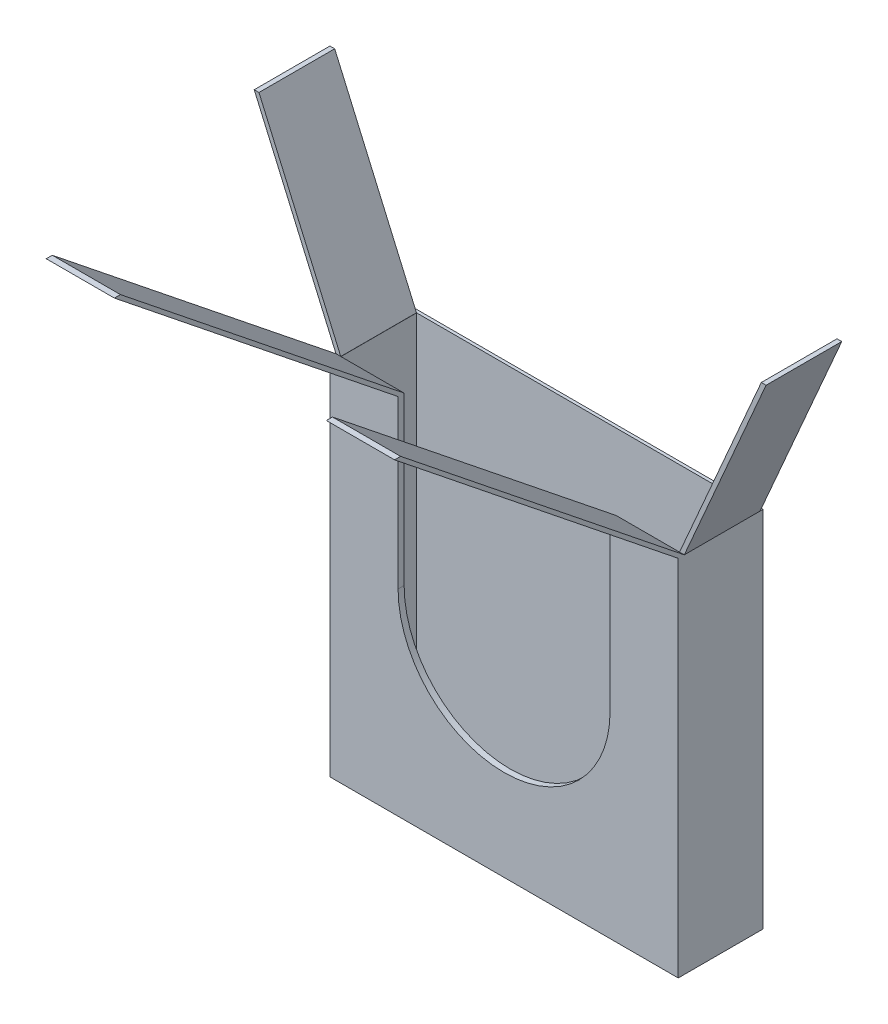
ISO-10303-21;
HEADER;
FILE_DESCRIPTION(('STEP AP214'),'2;1');
FILE_NAME('part.step','',(''),(''),'','','');
FILE_SCHEMA(('AUTOMOTIVE_DESIGN { 1 0 10303 214 1 1 1 1 }'));
ENDSEC;
DATA;
#1=APPLICATION_CONTEXT('core data for automotive mechanical design processes');
#2=APPLICATION_PROTOCOL_DEFINITION('international standard','automotive_design',2000,#1);
#3=PRODUCT_CONTEXT('',#1,'mechanical');
#4=PRODUCT('Part','Part','',(#3));
#5=PRODUCT_RELATED_PRODUCT_CATEGORY('part','',(#4));
#6=PRODUCT_DEFINITION_FORMATION('','',#4);
#7=PRODUCT_DEFINITION_CONTEXT('part definition',#1,'design');
#8=PRODUCT_DEFINITION('design','',#6,#7);
#9=PRODUCT_DEFINITION_SHAPE('','',#8);
#10=(LENGTH_UNIT() NAMED_UNIT(*) SI_UNIT(.MILLI.,.METRE.));
#11=(NAMED_UNIT(*) PLANE_ANGLE_UNIT() SI_UNIT($,.RADIAN.));
#12=(NAMED_UNIT(*) SI_UNIT($,.STERADIAN.) SOLID_ANGLE_UNIT());
#13=UNCERTAINTY_MEASURE_WITH_UNIT(LENGTH_MEASURE(1.E-05),#10,'distance_accuracy_value','');
#14=(GEOMETRIC_REPRESENTATION_CONTEXT(3) GLOBAL_UNCERTAINTY_ASSIGNED_CONTEXT((#13)) GLOBAL_UNIT_ASSIGNED_CONTEXT((#10,
#11,#12)) REPRESENTATION_CONTEXT('',''));
#15=CARTESIAN_POINT('',(0.,0.,0.));
#16=DIRECTION('',(0.,0.,1.));
#17=DIRECTION('',(1.,0.,0.));
#18=AXIS2_PLACEMENT_3D('',#15,#16,#17);
#19=CARTESIAN_POINT('',(0.,0.,-63.5));
#20=DIRECTION('',(0.,0.,-1.));
#21=DIRECTION('',(-1.,0.,0.));
#22=AXIS2_PLACEMENT_3D('',#19,#20,#21);
#23=PLANE('',#22);
#24=DIRECTION('',(1.,0.,0.));
#25=VECTOR('',#24,1.);
#26=CARTESIAN_POINT('',(146.05,152.399999999999,-63.5));
#27=LINE('',#26,#25);
#28=CARTESIAN_POINT('',(-146.05,152.399999999999,-63.5));
#29=VERTEX_POINT('',#28);
#30=CARTESIAN_POINT('',(-142.059608362807,152.399999999999,-63.5));
#31=VERTEX_POINT('',#30);
#32=EDGE_CURVE('E45',#29,#31,#27,.T.);
#33=ORIENTED_EDGE('',*,*,#32,.F.);
#34=DIRECTION('',(0.399280062298119,-0.91682900905851,0.));
#35=VECTOR('',#34,1.);
#36=CARTESIAN_POINT('',(-146.05,152.399999999999,-63.5));
#37=LINE('',#36,#35);
#38=CARTESIAN_POINT('',(-214.625070232172,309.862442089425,-63.5));
#39=VERTEX_POINT('',#38);
#40=EDGE_CURVE('E260',#39,#29,#37,.T.);
#41=ORIENTED_EDGE('',*,*,#40,.F.);
#42=DIRECTION('',(-1.,0.,0.));
#43=VECTOR('',#42,1.);
#44=CARTESIAN_POINT('',(-214.625070232172,309.862442089425,-63.5));
#45=LINE('',#44,#43);
#46=CARTESIAN_POINT('',(-210.634678594979,309.862442089425,-63.5));
#47=VERTEX_POINT('',#46);
#48=EDGE_CURVE('E256',#47,#39,#45,.T.);
#49=ORIENTED_EDGE('',*,*,#48,.F.);
#50=DIRECTION('',(-0.399280062298119,0.91682900905851,0.));
#51=VECTOR('',#50,1.);
#52=CARTESIAN_POINT('',(-210.634678594979,309.862442089425,-63.5));
#53=LINE('',#52,#51);
#54=EDGE_CURVE('E53',#31,#47,#53,.T.);
#55=ORIENTED_EDGE('',*,*,#54,.F.);
#56=EDGE_LOOP('',(#33,#41,#49,#55));
#57=FACE_BOUND('',#56,.T.);
#58=ADVANCED_FACE('F35',(#57),#23,.T.);
#59=CARTESIAN_POINT('',(-146.05,152.399999999999,5.08));
#60=DIRECTION('',(0.,-1.,0.));
#61=DIRECTION('',(1.,0.,0.));
#62=AXIS2_PLACEMENT_3D('',#59,#60,#61);
#63=PLANE('',#62);
#64=DIRECTION('',(0.,0.,-1.));
#65=VECTOR('',#64,1.);
#66=CARTESIAN_POINT('',(-142.059608362807,152.399999999999,173.378680710981));
#67=LINE('',#66,#65);
#68=CARTESIAN_POINT('',(-142.059608362807,152.399999999999,0.));
#69=VERTEX_POINT('',#68);
#70=EDGE_CURVE('E255',#69,#31,#67,.T.);
#71=ORIENTED_EDGE('',*,*,#70,.F.);
#72=DIRECTION('',(1.,0.,0.));
#73=VECTOR('',#72,1.);
#74=CARTESIAN_POINT('',(-454.831897372867,152.399999999999,0.));
#75=LINE('',#74,#73);
#76=CARTESIAN_POINT('',(-141.934676660714,152.399999999999,0.));
#77=VERTEX_POINT('',#76);
#78=EDGE_CURVE('E245',#69,#77,#75,.T.);
#79=ORIENTED_EDGE('',*,*,#78,.T.);
#80=DIRECTION('',(0.,0.,1.));
#81=VECTOR('',#80,1.);
#82=CARTESIAN_POINT('',(-141.934676660714,152.399999999999,-63.5));
#83=LINE('',#82,#81);
#84=CARTESIAN_POINT('',(-141.934676660714,152.399999999999,-63.5));
#85=VERTEX_POINT('',#84);
#86=EDGE_CURVE('E312',#85,#77,#83,.T.);
#87=ORIENTED_EDGE('',*,*,#86,.F.);
#88=CARTESIAN_POINT('',(142.059608362807,152.399999999999,-63.5));
#89=VERTEX_POINT('',#88);
#90=EDGE_CURVE('E46',#85,#89,#27,.T.);
#91=ORIENTED_EDGE('',*,*,#90,.T.);
#92=CARTESIAN_POINT('',(146.05,152.399999999999,-63.5));
#93=VERTEX_POINT('',#92);
#94=EDGE_CURVE('E11',#89,#93,#27,.T.);
#95=ORIENTED_EDGE('',*,*,#94,.T.);
#96=DIRECTION('',(0.,0.,1.));
#97=VECTOR('',#96,1.);
#98=CARTESIAN_POINT('',(146.05,152.399999999999,-66.04));
#99=LINE('',#98,#97);
#100=CARTESIAN_POINT('',(146.05,152.399999999999,-66.04));
#101=VERTEX_POINT('',#100);
#102=EDGE_CURVE('E224',#101,#93,#99,.T.);
#103=ORIENTED_EDGE('',*,*,#102,.F.);
#104=DIRECTION('',(1.,0.,0.));
#105=VECTOR('',#104,1.);
#106=CARTESIAN_POINT('',(146.05,152.399999999999,-66.04));
#107=LINE('',#106,#105);
#108=CARTESIAN_POINT('',(-146.05,152.399999999999,-66.04));
#109=VERTEX_POINT('',#108);
#110=EDGE_CURVE('E218',#109,#101,#107,.T.);
#111=ORIENTED_EDGE('',*,*,#110,.F.);
#112=DIRECTION('',(0.,0.,1.));
#113=VECTOR('',#112,1.);
#114=CARTESIAN_POINT('',(-146.05,152.399999999999,-66.04));
#115=LINE('',#114,#113);
#116=EDGE_CURVE('E227',#109,#29,#115,.T.);
#117=ORIENTED_EDGE('',*,*,#116,.T.);
#118=ORIENTED_EDGE('',*,*,#32,.T.);
#119=EDGE_LOOP('',(#71,#79,#87,#91,#95,#103,#111,#117,#118));
#120=FACE_BOUND('',#119,.T.);
#121=ADVANCED_FACE('F447',(#120),#63,.F.);
#122=CARTESIAN_POINT('',(88.9,152.399999999999,5.08));
#123=DIRECTION('',(1.,0.,0.));
#124=DIRECTION('',(0.,1.,0.));
#125=AXIS2_PLACEMENT_3D('',#122,#123,#124);
#126=PLANE('',#125);
#127=DIRECTION('',(0.,-1.,0.));
#128=VECTOR('',#127,1.);
#129=CARTESIAN_POINT('',(88.9,152.399999999999,0.));
#130=LINE('',#129,#128);
#131=CARTESIAN_POINT('',(88.9,152.399999999999,0.));
#132=VERTEX_POINT('',#131);
#133=CARTESIAN_POINT('',(88.9,12.6999999999994,0.));
#134=VERTEX_POINT('',#133);
#135=EDGE_CURVE('E372',#132,#134,#130,.T.);
#136=ORIENTED_EDGE('',*,*,#135,.T.);
#137=DIRECTION('',(0.,0.,-1.));
#138=VECTOR('',#137,1.);
#139=CARTESIAN_POINT('',(88.9,12.6999999999994,5.08));
#140=LINE('',#139,#138);
#141=CARTESIAN_POINT('',(88.9,12.6999999999994,5.08));
#142=VERTEX_POINT('',#141);
#143=EDGE_CURVE('E39',#142,#134,#140,.T.);
#144=ORIENTED_EDGE('',*,*,#143,.F.);
#145=DIRECTION('',(0.,-1.,0.));
#146=VECTOR('',#145,1.);
#147=CARTESIAN_POINT('',(88.9,152.399999999999,5.08));
#148=LINE('',#147,#146);
#149=CARTESIAN_POINT('',(88.9,152.399999999999,5.08));
#150=VERTEX_POINT('',#149);
#151=EDGE_CURVE('E353',#150,#142,#148,.T.);
#152=ORIENTED_EDGE('',*,*,#151,.F.);
#153=DIRECTION('',(0.,0.625,0.7806247497998));
#154=VECTOR('',#153,1.);
#155=CARTESIAN_POINT('',(88.9000000000001,152.399999999999,5.07999999999996));
#156=LINE('',#155,#154);
#157=CARTESIAN_POINT('',(88.9,342.899999999999,243.014423738979));
#158=VERTEX_POINT('',#157);
#159=EDGE_CURVE('E333',#150,#158,#156,.T.);
#160=ORIENTED_EDGE('',*,*,#159,.T.);
#161=DIRECTION('',(0.,0.,-1.));
#162=VECTOR('',#161,1.);
#163=CARTESIAN_POINT('',(88.9,342.899999999999,243.014423738979));
#164=LINE('',#163,#162);
#165=CARTESIAN_POINT('',(88.9,342.899999999999,237.934423738979));
#166=VERTEX_POINT('',#165);
#167=EDGE_CURVE('E331',#158,#166,#164,.T.);
#168=ORIENTED_EDGE('',*,*,#167,.T.);
#169=DIRECTION('',(0.,-0.625,-0.7806247497998));
#170=VECTOR('',#169,1.);
#171=CARTESIAN_POINT('',(88.9,342.899999999999,237.934423738979));
#172=LINE('',#171,#170);
#173=EDGE_CURVE('E336',#166,#132,#172,.T.);
#174=ORIENTED_EDGE('',*,*,#173,.T.);
#175=EDGE_LOOP('',(#136,#144,#152,#160,#168,#174));
#176=FACE_BOUND('',#175,.T.);
#177=ADVANCED_FACE('F37',(#176),#126,.F.);
#178=CARTESIAN_POINT('',(0.,12.6999999999994,5.08));
#179=DIRECTION('',(0.,0.,-1.));
#180=DIRECTION('',(-1.,0.,0.));
#181=AXIS2_PLACEMENT_3D('',#178,#179,#180);
#182=CYLINDRICAL_SURFACE('',#181,88.9);
#183=CARTESIAN_POINT('',(0.,12.6999999999994,0.));
#184=DIRECTION('',(0.,0.,-1.));
#185=DIRECTION('',(1.,0.,0.));
#186=AXIS2_PLACEMENT_3D('',#183,#184,#185);
#187=CIRCLE('',#186,88.9);
#188=CARTESIAN_POINT('',(-88.8999999999999,12.6999999999994,0.));
#189=VERTEX_POINT('',#188);
#190=EDGE_CURVE('E374',#134,#189,#187,.T.);
#191=ORIENTED_EDGE('',*,*,#190,.T.);
#192=DIRECTION('',(0.,0.,-1.));
#193=VECTOR('',#192,1.);
#194=CARTESIAN_POINT('',(-88.8999999999999,12.6999999999994,5.08));
#195=LINE('',#194,#193);
#196=CARTESIAN_POINT('',(-88.8999999999999,12.6999999999994,5.08));
#197=VERTEX_POINT('',#196);
#198=EDGE_CURVE('E380',#197,#189,#195,.T.);
#199=ORIENTED_EDGE('',*,*,#198,.F.);
#200=CARTESIAN_POINT('',(0.,12.6999999999994,5.08));
#201=DIRECTION('',(0.,0.,-1.));
#202=DIRECTION('',(1.,0.,0.));
#203=AXIS2_PLACEMENT_3D('',#200,#201,#202);
#204=CIRCLE('',#203,88.9);
#205=EDGE_CURVE('E356',#142,#197,#204,.T.);
#206=ORIENTED_EDGE('',*,*,#205,.F.);
#207=ORIENTED_EDGE('',*,*,#143,.T.);
#208=EDGE_LOOP('',(#191,#199,#206,#207));
#209=FACE_BOUND('',#208,.T.);
#210=ADVANCED_FACE('F391',(#209),#182,.F.);
#211=CARTESIAN_POINT('',(-88.8999999999999,152.399999999999,5.08));
#212=DIRECTION('',(-1.,0.,0.));
#213=DIRECTION('',(0.,-1.,0.));
#214=AXIS2_PLACEMENT_3D('',#211,#212,#213);
#215=PLANE('',#214);
#216=DIRECTION('',(0.,1.,0.));
#217=VECTOR('',#216,1.);
#218=CARTESIAN_POINT('',(-88.8999999999999,152.399999999999,0.));
#219=LINE('',#218,#217);
#220=CARTESIAN_POINT('',(-88.8999999999999,152.399999999999,0.));
#221=VERTEX_POINT('',#220);
#222=EDGE_CURVE('E376',#189,#221,#219,.T.);
#223=ORIENTED_EDGE('',*,*,#222,.T.);
#224=DIRECTION('',(0.,0.625,0.7806247497998));
#225=VECTOR('',#224,1.);
#226=CARTESIAN_POINT('',(-88.9,342.899999999999,237.934423738979));
#227=LINE('',#226,#225);
#228=CARTESIAN_POINT('',(-88.9,342.899999999999,237.934423738979));
#229=VERTEX_POINT('',#228);
#230=EDGE_CURVE('E230',#221,#229,#227,.T.);
#231=ORIENTED_EDGE('',*,*,#230,.T.);
#232=DIRECTION('',(0.,0.,1.));
#233=VECTOR('',#232,1.);
#234=CARTESIAN_POINT('',(-88.9,342.899999999999,243.014423738979));
#235=LINE('',#234,#233);
#236=CARTESIAN_POINT('',(-88.9,342.899999999999,243.014423738979));
#237=VERTEX_POINT('',#236);
#238=EDGE_CURVE('E239',#229,#237,#235,.T.);
#239=ORIENTED_EDGE('',*,*,#238,.T.);
#240=DIRECTION('',(0.,-0.625,-0.7806247497998));
#241=VECTOR('',#240,1.);
#242=CARTESIAN_POINT('',(-88.8999999999999,152.399999999999,5.08));
#243=LINE('',#242,#241);
#244=CARTESIAN_POINT('',(-88.8999999999999,152.399999999999,5.08));
#245=VERTEX_POINT('',#244);
#246=EDGE_CURVE('E242',#237,#245,#243,.T.);
#247=ORIENTED_EDGE('',*,*,#246,.T.);
#248=DIRECTION('',(0.,1.,0.));
#249=VECTOR('',#248,1.);
#250=CARTESIAN_POINT('',(-88.8999999999999,152.399999999999,5.08));
#251=LINE('',#250,#249);
#252=EDGE_CURVE('E358',#197,#245,#251,.T.);
#253=ORIENTED_EDGE('',*,*,#252,.F.);
#254=ORIENTED_EDGE('',*,*,#198,.T.);
#255=EDGE_LOOP('',(#223,#231,#239,#247,#253,#254));
#256=FACE_BOUND('',#255,.T.);
#257=ADVANCED_FACE('F398',(#256),#215,.F.);
#258=CARTESIAN_POINT('',(-146.05,-152.400000000001,5.08));
#259=DIRECTION('',(1.,0.,0.));
#260=DIRECTION('',(0.,0.,-1.));
#261=AXIS2_PLACEMENT_3D('',#258,#259,#260);
#262=PLANE('',#261);
#263=DIRECTION('',(0.,-1.,0.));
#264=VECTOR('',#263,1.);
#265=CARTESIAN_POINT('',(-146.05,-152.400000000001,5.08));
#266=LINE('',#265,#264);
#267=CARTESIAN_POINT('',(-146.05,152.399999999999,5.08));
#268=VERTEX_POINT('',#267);
#269=CARTESIAN_POINT('',(-146.05,-152.400000000001,5.08));
#270=VERTEX_POINT('',#269);
#271=EDGE_CURVE('E364',#268,#270,#266,.T.);
#272=ORIENTED_EDGE('',*,*,#271,.F.);
#273=DIRECTION('',(0.,0.625,0.7806247497998));
#274=VECTOR('',#273,1.);
#275=CARTESIAN_POINT('',(-146.05,152.399999999999,5.07999999999999));
#276=LINE('',#275,#274);
#277=CARTESIAN_POINT('',(-146.05,342.899999999999,243.014423738979));
#278=VERTEX_POINT('',#277);
#279=EDGE_CURVE('E233',#268,#278,#276,.T.);
#280=ORIENTED_EDGE('',*,*,#279,.T.);
#281=DIRECTION('',(0.,0.,-1.));
#282=VECTOR('',#281,1.);
#283=CARTESIAN_POINT('',(-146.05,342.899999999999,243.014423738979));
#284=LINE('',#283,#282);
#285=CARTESIAN_POINT('',(-146.05,342.899999999999,237.934423738979));
#286=VERTEX_POINT('',#285);
#287=EDGE_CURVE('E231',#278,#286,#284,.T.);
#288=ORIENTED_EDGE('',*,*,#287,.T.);
#289=DIRECTION('',(0.,-0.625,-0.7806247497998));
#290=VECTOR('',#289,1.);
#291=CARTESIAN_POINT('',(-146.05,342.899999999999,237.934423738979));
#292=LINE('',#291,#290);
#293=CARTESIAN_POINT('',(-146.05,152.399999999999,0.));
#294=VERTEX_POINT('',#293);
#295=EDGE_CURVE('E236',#286,#294,#292,.T.);
#296=ORIENTED_EDGE('',*,*,#295,.T.);
#297=DIRECTION('',(0.,0.,-1.));
#298=VECTOR('',#297,1.);
#299=CARTESIAN_POINT('',(-146.05,152.399999999999,173.378680710981));
#300=LINE('',#299,#298);
#301=EDGE_CURVE('E252',#294,#29,#300,.T.);
#302=ORIENTED_EDGE('',*,*,#301,.T.);
#303=ORIENTED_EDGE('',*,*,#116,.F.);
#304=DIRECTION('',(0.,1.,0.));
#305=VECTOR('',#304,1.);
#306=CARTESIAN_POINT('',(-146.05,-152.400000000001,-66.04));
#307=LINE('',#306,#305);
#308=CARTESIAN_POINT('',(-146.05,-152.400000000001,-66.04));
#309=VERTEX_POINT('',#308);
#310=EDGE_CURVE('E214',#309,#109,#307,.T.);
#311=ORIENTED_EDGE('',*,*,#310,.F.);
#312=DIRECTION('',(0.,0.,-1.));
#313=VECTOR('',#312,1.);
#314=CARTESIAN_POINT('',(-146.05,-152.400000000001,5.08));
#315=LINE('',#314,#313);
#316=EDGE_CURVE('E206',#270,#309,#315,.T.);
#317=ORIENTED_EDGE('',*,*,#316,.F.);
#318=EDGE_LOOP('',(#272,#280,#288,#296,#302,#303,#311,#317));
#319=FACE_BOUND('',#318,.T.);
#320=ADVANCED_FACE('F461',(#319),#262,.F.);
#321=CARTESIAN_POINT('',(-146.05,-152.400000000001,5.08));
#322=DIRECTION('',(0.,1.,0.));
#323=DIRECTION('',(-1.,0.,0.));
#324=AXIS2_PLACEMENT_3D('',#321,#322,#323);
#325=PLANE('',#324);
#326=ORIENTED_EDGE('',*,*,#316,.T.);
#327=DIRECTION('',(-1.,0.,0.));
#328=VECTOR('',#327,1.);
#329=CARTESIAN_POINT('',(146.05,-152.400000000001,-66.04));
#330=LINE('',#329,#328);
#331=CARTESIAN_POINT('',(146.05,-152.400000000001,-66.04));
#332=VERTEX_POINT('',#331);
#333=EDGE_CURVE('E209',#332,#309,#330,.T.);
#334=ORIENTED_EDGE('',*,*,#333,.F.);
#335=DIRECTION('',(0.,0.,-1.));
#336=VECTOR('',#335,1.);
#337=CARTESIAN_POINT('',(146.05,-152.400000000001,5.08));
#338=LINE('',#337,#336);
#339=CARTESIAN_POINT('',(146.05,-152.400000000001,5.08));
#340=VERTEX_POINT('',#339);
#341=EDGE_CURVE('E196',#340,#332,#338,.T.);
#342=ORIENTED_EDGE('',*,*,#341,.F.);
#343=DIRECTION('',(1.,0.,0.));
#344=VECTOR('',#343,1.);
#345=CARTESIAN_POINT('',(-146.05,-152.400000000001,5.08));
#346=LINE('',#345,#344);
#347=EDGE_CURVE('E366',#270,#340,#346,.T.);
#348=ORIENTED_EDGE('',*,*,#347,.F.);
#349=EDGE_LOOP('',(#326,#334,#342,#348));
#350=FACE_BOUND('',#349,.T.);
#351=ADVANCED_FACE('F210',(#350),#325,.F.);
#352=CARTESIAN_POINT('',(146.05,-152.400000000001,5.08));
#353=DIRECTION('',(-1.,0.,0.));
#354=DIRECTION('',(0.,-1.,0.));
#355=AXIS2_PLACEMENT_3D('',#352,#353,#354);
#356=PLANE('',#355);
#357=ORIENTED_EDGE('',*,*,#341,.T.);
#358=DIRECTION('',(0.,-1.,0.));
#359=VECTOR('',#358,1.);
#360=CARTESIAN_POINT('',(146.05,-152.400000000001,-66.04));
#361=LINE('',#360,#359);
#362=EDGE_CURVE('E201',#101,#332,#361,.T.);
#363=ORIENTED_EDGE('',*,*,#362,.F.);
#364=ORIENTED_EDGE('',*,*,#102,.T.);
#365=DIRECTION('',(0.,0.,1.));
#366=VECTOR('',#365,1.);
#367=CARTESIAN_POINT('',(146.05,152.399999999999,-63.5));
#368=LINE('',#367,#366);
#369=CARTESIAN_POINT('',(146.05,152.399999999999,0.));
#370=VERTEX_POINT('',#369);
#371=EDGE_CURVE('E320',#93,#370,#368,.T.);
#372=ORIENTED_EDGE('',*,*,#371,.T.);
#373=DIRECTION('',(0.,0.625,0.7806247497998));
#374=VECTOR('',#373,1.);
#375=CARTESIAN_POINT('',(146.05,342.899999999999,237.934423738979));
#376=LINE('',#375,#374);
#377=CARTESIAN_POINT('',(146.05,342.899999999999,237.934423738979));
#378=VERTEX_POINT('',#377);
#379=EDGE_CURVE('E330',#370,#378,#376,.T.);
#380=ORIENTED_EDGE('',*,*,#379,.T.);
#381=DIRECTION('',(0.,0.,1.));
#382=VECTOR('',#381,1.);
#383=CARTESIAN_POINT('',(146.05,342.899999999999,243.014423738979));
#384=LINE('',#383,#382);
#385=CARTESIAN_POINT('',(146.05,342.899999999999,243.014423738979));
#386=VERTEX_POINT('',#385);
#387=EDGE_CURVE('E339',#378,#386,#384,.T.);
#388=ORIENTED_EDGE('',*,*,#387,.T.);
#389=DIRECTION('',(0.,-0.625,-0.7806247497998));
#390=VECTOR('',#389,1.);
#391=CARTESIAN_POINT('',(146.05,152.399999999999,5.08));
#392=LINE('',#391,#390);
#393=CARTESIAN_POINT('',(146.05,152.399999999999,5.08));
#394=VERTEX_POINT('',#393);
#395=EDGE_CURVE('E342',#386,#394,#392,.T.);
#396=ORIENTED_EDGE('',*,*,#395,.T.);
#397=DIRECTION('',(0.,1.,0.));
#398=VECTOR('',#397,1.);
#399=CARTESIAN_POINT('',(146.05,-152.400000000001,5.08));
#400=LINE('',#399,#398);
#401=EDGE_CURVE('E203',#340,#394,#400,.T.);
#402=ORIENTED_EDGE('',*,*,#401,.F.);
#403=EDGE_LOOP('',(#357,#363,#364,#372,#380,#388,#396,#402));
#404=FACE_BOUND('',#403,.T.);
#405=ADVANCED_FACE('F198',(#404),#356,.F.);
#406=CARTESIAN_POINT('',(0.,12.6999999999994,5.08));
#407=DIRECTION('',(0.,0.,1.));
#408=DIRECTION('',(1.,0.,0.));
#409=AXIS2_PLACEMENT_3D('',#406,#407,#408);
#410=PLANE('',#409);
#411=DIRECTION('',(-1.,0.,0.));
#412=VECTOR('',#411,1.);
#413=CARTESIAN_POINT('',(88.9,152.399999999999,5.08));
#414=LINE('',#413,#412);
#415=EDGE_CURVE('E350',#394,#150,#414,.T.);
#416=ORIENTED_EDGE('',*,*,#415,.T.);
#417=ORIENTED_EDGE('',*,*,#151,.T.);
#418=ORIENTED_EDGE('',*,*,#205,.T.);
#419=ORIENTED_EDGE('',*,*,#252,.T.);
#420=DIRECTION('',(-1.,0.,0.));
#421=VECTOR('',#420,1.);
#422=CARTESIAN_POINT('',(-146.05,152.399999999999,5.08));
#423=LINE('',#422,#421);
#424=EDGE_CURVE('E361',#245,#268,#423,.T.);
#425=ORIENTED_EDGE('',*,*,#424,.T.);
#426=ORIENTED_EDGE('',*,*,#271,.T.);
#427=ORIENTED_EDGE('',*,*,#347,.T.);
#428=ORIENTED_EDGE('',*,*,#401,.T.);
#429=EDGE_LOOP('',(#416,#417,#418,#419,#425,#426,#427,#428));
#430=FACE_BOUND('',#429,.T.);
#431=ADVANCED_FACE('F413',(#430),#410,.T.);
#432=CARTESIAN_POINT('',(0.,12.6999999999994,0.));
#433=DIRECTION('',(0.,0.,1.));
#434=DIRECTION('',(1.,0.,0.));
#435=AXIS2_PLACEMENT_3D('',#432,#433,#434);
#436=PLANE('',#435);
#437=DIRECTION('',(-1.,0.,0.));
#438=VECTOR('',#437,1.);
#439=CARTESIAN_POINT('',(0.,-147.172428926353,0.));
#440=LINE('',#439,#438);
#441=CARTESIAN_POINT('',(142.059608362807,-147.172428926353,0.));
#442=VERTEX_POINT('',#441);
#443=CARTESIAN_POINT('',(-141.934676660714,-147.172428926353,0.));
#444=VERTEX_POINT('',#443);
#445=EDGE_CURVE('E314',#442,#444,#440,.T.);
#446=ORIENTED_EDGE('',*,*,#445,.T.);
#447=DIRECTION('',(0.,1.,0.));
#448=VECTOR('',#447,1.);
#449=CARTESIAN_POINT('',(-141.934676660714,0.,0.));
#450=LINE('',#449,#448);
#451=EDGE_CURVE('E61',#444,#77,#450,.T.);
#452=ORIENTED_EDGE('',*,*,#451,.T.);
#453=DIRECTION('',(-1.,0.,0.));
#454=VECTOR('',#453,1.);
#455=CARTESIAN_POINT('',(-146.05,152.399999999999,0.));
#456=LINE('',#455,#454);
#457=EDGE_CURVE('E354',#221,#77,#456,.T.);
#458=ORIENTED_EDGE('',*,*,#457,.F.);
#459=ORIENTED_EDGE('',*,*,#222,.F.);
#460=ORIENTED_EDGE('',*,*,#190,.F.);
#461=ORIENTED_EDGE('',*,*,#135,.F.);
#462=DIRECTION('',(-1.,0.,0.));
#463=VECTOR('',#462,1.);
#464=CARTESIAN_POINT('',(88.9,152.399999999999,0.));
#465=LINE('',#464,#463);
#466=CARTESIAN_POINT('',(142.059608362807,152.399999999999,0.));
#467=VERTEX_POINT('',#466);
#468=EDGE_CURVE('E349',#467,#132,#465,.T.);
#469=ORIENTED_EDGE('',*,*,#468,.F.);
#470=DIRECTION('',(0.,1.,0.));
#471=VECTOR('',#470,1.);
#472=CARTESIAN_POINT('',(142.059608362807,0.,0.));
#473=LINE('',#472,#471);
#474=EDGE_CURVE('E306',#442,#467,#473,.T.);
#475=ORIENTED_EDGE('',*,*,#474,.F.);
#476=EDGE_LOOP('',(#446,#452,#458,#459,#460,#461,#469,#475));
#477=FACE_BOUND('',#476,.T.);
#478=ADVANCED_FACE('F395',(#477),#436,.F.);
#479=CARTESIAN_POINT('',(-219.881897372867,152.399999999999,5.08));
#480=DIRECTION('',(0.,-0.7806247497998,0.625));
#481=DIRECTION('',(0.,-0.625,-0.7806247497998));
#482=AXIS2_PLACEMENT_3D('',#479,#480,#481);
#483=PLANE('',#482);
#484=ORIENTED_EDGE('',*,*,#159,.F.);
#485=ORIENTED_EDGE('',*,*,#415,.F.);
#486=ORIENTED_EDGE('',*,*,#395,.F.);
#487=DIRECTION('',(1.,0.,0.));
#488=VECTOR('',#487,1.);
#489=CARTESIAN_POINT('',(-219.881897372867,342.899999999999,243.014423738979));
#490=LINE('',#489,#488);
#491=EDGE_CURVE('E334',#158,#386,#490,.T.);
#492=ORIENTED_EDGE('',*,*,#491,.F.);
#493=EDGE_LOOP('',(#484,#485,#486,#492));
#494=FACE_BOUND('',#493,.T.);
#495=ADVANCED_FACE('F426',(#494),#483,.T.);
#496=CARTESIAN_POINT('',(-219.881897372867,342.899999999999,243.014423738979));
#497=DIRECTION('',(0.,1.,0.));
#498=DIRECTION('',(-1.,0.,0.));
#499=AXIS2_PLACEMENT_3D('',#496,#497,#498);
#500=PLANE('',#499);
#501=ORIENTED_EDGE('',*,*,#167,.F.);
#502=ORIENTED_EDGE('',*,*,#491,.T.);
#503=ORIENTED_EDGE('',*,*,#387,.F.);
#504=DIRECTION('',(1.,0.,0.));
#505=VECTOR('',#504,1.);
#506=CARTESIAN_POINT('',(-219.881897372867,342.899999999999,237.934423738979));
#507=LINE('',#506,#505);
#508=EDGE_CURVE('E344',#166,#378,#507,.T.);
#509=ORIENTED_EDGE('',*,*,#508,.F.);
#510=EDGE_LOOP('',(#501,#502,#503,#509));
#511=FACE_BOUND('',#510,.T.);
#512=ADVANCED_FACE('F422',(#511),#500,.T.);
#513=CARTESIAN_POINT('',(-219.881897372867,342.899999999999,237.934423738979));
#514=DIRECTION('',(0.,0.7806247497998,-0.625));
#515=DIRECTION('',(0.,0.625,0.7806247497998));
#516=AXIS2_PLACEMENT_3D('',#513,#514,#515);
#517=PLANE('',#516);
#518=ORIENTED_EDGE('',*,*,#173,.F.);
#519=ORIENTED_EDGE('',*,*,#508,.T.);
#520=ORIENTED_EDGE('',*,*,#379,.F.);
#521=EDGE_CURVE('E369',#370,#467,#465,.T.);
#522=ORIENTED_EDGE('',*,*,#521,.T.);
#523=ORIENTED_EDGE('',*,*,#468,.T.);
#524=EDGE_LOOP('',(#518,#519,#520,#522,#523));
#525=FACE_BOUND('',#524,.T.);
#526=ADVANCED_FACE('F429',(#525),#517,.T.);
#527=CARTESIAN_POINT('',(-141.934676660714,0.,-63.5));
#528=DIRECTION('',(1.,0.,0.));
#529=DIRECTION('',(0.,0.,-1.));
#530=AXIS2_PLACEMENT_3D('',#527,#528,#529);
#531=PLANE('',#530);
#532=ORIENTED_EDGE('',*,*,#451,.F.);
#533=DIRECTION('',(0.,0.,1.));
#534=VECTOR('',#533,1.);
#535=CARTESIAN_POINT('',(-141.934676660714,-147.172428926353,-63.5));
#536=LINE('',#535,#534);
#537=CARTESIAN_POINT('',(-141.934676660714,-147.172428926353,-63.5));
#538=VERTEX_POINT('',#537);
#539=EDGE_CURVE('E328',#538,#444,#536,.T.);
#540=ORIENTED_EDGE('',*,*,#539,.F.);
#541=DIRECTION('',(0.,1.,0.));
#542=VECTOR('',#541,1.);
#543=CARTESIAN_POINT('',(-141.934676660714,0.,-63.5));
#544=LINE('',#543,#542);
#545=EDGE_CURVE('E302',#538,#85,#544,.T.);
#546=ORIENTED_EDGE('',*,*,#545,.T.);
#547=ORIENTED_EDGE('',*,*,#86,.T.);
#548=EDGE_LOOP('',(#532,#540,#546,#547));
#549=FACE_BOUND('',#548,.T.);
#550=ADVANCED_FACE('F440',(#549),#531,.T.);
#551=CARTESIAN_POINT('',(0.,-147.172428926353,-63.5));
#552=DIRECTION('',(0.,1.,0.));
#553=DIRECTION('',(0.,0.,1.));
#554=AXIS2_PLACEMENT_3D('',#551,#552,#553);
#555=PLANE('',#554);
#556=ORIENTED_EDGE('',*,*,#445,.F.);
#557=DIRECTION('',(0.,0.,1.));
#558=VECTOR('',#557,1.);
#559=CARTESIAN_POINT('',(142.059608362807,-147.172428926353,-63.5));
#560=LINE('',#559,#558);
#561=CARTESIAN_POINT('',(142.059608362807,-147.172428926353,-63.5));
#562=VERTEX_POINT('',#561);
#563=EDGE_CURVE('E326',#562,#442,#560,.T.);
#564=ORIENTED_EDGE('',*,*,#563,.F.);
#565=DIRECTION('',(-1.,0.,0.));
#566=VECTOR('',#565,1.);
#567=CARTESIAN_POINT('',(0.,-147.172428926353,-63.5));
#568=LINE('',#567,#566);
#569=EDGE_CURVE('E305',#562,#538,#568,.T.);
#570=ORIENTED_EDGE('',*,*,#569,.T.);
#571=ORIENTED_EDGE('',*,*,#539,.T.);
#572=EDGE_LOOP('',(#556,#564,#570,#571));
#573=FACE_BOUND('',#572,.T.);
#574=ADVANCED_FACE('F438',(#573),#555,.T.);
#575=CARTESIAN_POINT('',(142.059608362807,0.,-63.5));
#576=DIRECTION('',(1.,0.,0.));
#577=DIRECTION('',(0.,0.,-1.));
#578=AXIS2_PLACEMENT_3D('',#575,#576,#577);
#579=PLANE('',#578);
#580=ORIENTED_EDGE('',*,*,#474,.T.);
#581=DIRECTION('',(0.,0.,1.));
#582=VECTOR('',#581,1.);
#583=CARTESIAN_POINT('',(142.059608362807,152.399999999999,-63.5));
#584=LINE('',#583,#582);
#585=EDGE_CURVE('E323',#89,#467,#584,.T.);
#586=ORIENTED_EDGE('',*,*,#585,.F.);
#587=DIRECTION('',(0.,1.,0.));
#588=VECTOR('',#587,1.);
#589=CARTESIAN_POINT('',(142.059608362807,0.,-63.5));
#590=LINE('',#589,#588);
#591=EDGE_CURVE('E309',#562,#89,#590,.T.);
#592=ORIENTED_EDGE('',*,*,#591,.F.);
#593=ORIENTED_EDGE('',*,*,#563,.T.);
#594=EDGE_LOOP('',(#580,#586,#592,#593));
#595=FACE_BOUND('',#594,.T.);
#596=ADVANCED_FACE('F434',(#595),#579,.F.);
#597=ORIENTED_EDGE('',*,*,#94,.F.);
#598=DIRECTION('',(0.399280062298119,0.91682900905851,0.));
#599=VECTOR('',#598,1.);
#600=CARTESIAN_POINT('',(210.634678594979,309.862442089425,-63.5));
#601=LINE('',#600,#599);
#602=CARTESIAN_POINT('',(210.634678594979,309.862442089425,-63.5));
#603=VERTEX_POINT('',#602);
#604=EDGE_CURVE('E267',#89,#603,#601,.T.);
#605=ORIENTED_EDGE('',*,*,#604,.T.);
#606=DIRECTION('',(1.,0.,0.));
#607=VECTOR('',#606,1.);
#608=CARTESIAN_POINT('',(214.625070232172,309.862442089425,-63.5));
#609=LINE('',#608,#607);
#610=CARTESIAN_POINT('',(214.625070232172,309.862442089425,-63.5));
#611=VERTEX_POINT('',#610);
#612=EDGE_CURVE('E285',#603,#611,#609,.T.);
#613=ORIENTED_EDGE('',*,*,#612,.T.);
#614=DIRECTION('',(-0.399280062298119,-0.91682900905851,0.));
#615=VECTOR('',#614,1.);
#616=CARTESIAN_POINT('',(146.05,152.399999999999,-63.5));
#617=LINE('',#616,#615);
#618=EDGE_CURVE('E281',#611,#93,#617,.T.);
#619=ORIENTED_EDGE('',*,*,#618,.T.);
#620=EDGE_LOOP('',(#597,#605,#613,#619));
#621=FACE_BOUND('',#620,.T.);
#622=ADVANCED_FACE('F475',(#621),#23,.T.);
#623=CARTESIAN_POINT('',(0.,12.6999999999994,0.));
#624=DIRECTION('',(0.,0.,1.));
#625=DIRECTION('',(1.,0.,0.));
#626=AXIS2_PLACEMENT_3D('',#623,#624,#625);
#627=PLANE('',#626);
#628=ORIENTED_EDGE('',*,*,#521,.F.);
#629=DIRECTION('',(-0.399280062298119,-0.91682900905851,0.));
#630=VECTOR('',#629,1.);
#631=CARTESIAN_POINT('',(146.05,152.399999999999,0.));
#632=LINE('',#631,#630);
#633=CARTESIAN_POINT('',(214.625070232172,309.862442089425,0.));
#634=VERTEX_POINT('',#633);
#635=EDGE_CURVE('E293',#634,#370,#632,.T.);
#636=ORIENTED_EDGE('',*,*,#635,.F.);
#637=DIRECTION('',(1.,0.,0.));
#638=VECTOR('',#637,1.);
#639=CARTESIAN_POINT('',(214.625070232172,309.862442089425,0.));
#640=LINE('',#639,#638);
#641=CARTESIAN_POINT('',(210.634678594979,309.862442089425,0.));
#642=VERTEX_POINT('',#641);
#643=EDGE_CURVE('E297',#642,#634,#640,.T.);
#644=ORIENTED_EDGE('',*,*,#643,.F.);
#645=DIRECTION('',(0.399280062298119,0.91682900905851,0.));
#646=VECTOR('',#645,1.);
#647=CARTESIAN_POINT('',(210.634678594979,309.862442089425,0.));
#648=LINE('',#647,#646);
#649=EDGE_CURVE('E284',#467,#642,#648,.T.);
#650=ORIENTED_EDGE('',*,*,#649,.F.);
#651=EDGE_LOOP('',(#628,#636,#644,#650));
#652=FACE_BOUND('',#651,.T.);
#653=ADVANCED_FACE('F483',(#652),#627,.T.);
#654=CARTESIAN_POINT('',(210.634678594979,309.862442089425,173.378680710981));
#655=DIRECTION('',(-0.91682900905851,0.399280062298119,0.));
#656=DIRECTION('',(-0.399280062298119,-0.91682900905851,0.));
#657=AXIS2_PLACEMENT_3D('',#654,#655,#656);
#658=PLANE('',#657);
#659=ORIENTED_EDGE('',*,*,#585,.T.);
#660=ORIENTED_EDGE('',*,*,#649,.T.);
#661=DIRECTION('',(0.,0.,-1.));
#662=VECTOR('',#661,1.);
#663=CARTESIAN_POINT('',(210.634678594979,309.862442089425,173.378680710981));
#664=LINE('',#663,#662);
#665=EDGE_CURVE('E292',#642,#603,#664,.T.);
#666=ORIENTED_EDGE('',*,*,#665,.T.);
#667=ORIENTED_EDGE('',*,*,#604,.F.);
#668=EDGE_LOOP('',(#659,#660,#666,#667));
#669=FACE_BOUND('',#668,.T.);
#670=ADVANCED_FACE('F489',(#669),#658,.T.);
#671=CARTESIAN_POINT('',(214.625070232172,309.862442089425,173.378680710981));
#672=DIRECTION('',(0.,1.,0.));
#673=DIRECTION('',(0.,0.,1.));
#674=AXIS2_PLACEMENT_3D('',#671,#672,#673);
#675=PLANE('',#674);
#676=ORIENTED_EDGE('',*,*,#665,.F.);
#677=ORIENTED_EDGE('',*,*,#643,.T.);
#678=DIRECTION('',(0.,0.,-1.));
#679=VECTOR('',#678,1.);
#680=CARTESIAN_POINT('',(214.625070232172,309.862442089425,173.378680710981));
#681=LINE('',#680,#679);
#682=EDGE_CURVE('E296',#634,#611,#681,.T.);
#683=ORIENTED_EDGE('',*,*,#682,.T.);
#684=ORIENTED_EDGE('',*,*,#612,.F.);
#685=EDGE_LOOP('',(#676,#677,#683,#684));
#686=FACE_BOUND('',#685,.T.);
#687=ADVANCED_FACE('F497',(#686),#675,.T.);
#688=CARTESIAN_POINT('',(146.05,152.399999999999,173.378680710981));
#689=DIRECTION('',(0.91682900905851,-0.399280062298119,0.));
#690=DIRECTION('',(0.399280062298119,0.91682900905851,0.));
#691=AXIS2_PLACEMENT_3D('',#688,#689,#690);
#692=PLANE('',#691);
#693=ORIENTED_EDGE('',*,*,#682,.F.);
#694=ORIENTED_EDGE('',*,*,#635,.T.);
#695=ORIENTED_EDGE('',*,*,#371,.F.);
#696=ORIENTED_EDGE('',*,*,#618,.F.);
#697=EDGE_LOOP('',(#693,#694,#695,#696));
#698=FACE_BOUND('',#697,.T.);
#699=ADVANCED_FACE('F471',(#698),#692,.T.);
#700=CARTESIAN_POINT('',(-210.634678594979,309.862442089425,173.378680710981));
#701=DIRECTION('',(-0.91682900905851,-0.399280062298119,0.));
#702=DIRECTION('',(0.399280062298119,-0.91682900905851,0.));
#703=AXIS2_PLACEMENT_3D('',#700,#701,#702);
#704=PLANE('',#703);
#705=DIRECTION('',(-0.399280062298119,0.91682900905851,0.));
#706=VECTOR('',#705,1.);
#707=CARTESIAN_POINT('',(-210.634678594979,309.862442089425,0.));
#708=LINE('',#707,#706);
#709=CARTESIAN_POINT('',(-210.634678594979,309.862442089425,0.));
#710=VERTEX_POINT('',#709);
#711=EDGE_CURVE('E268',#69,#710,#708,.T.);
#712=ORIENTED_EDGE('',*,*,#711,.F.);
#713=ORIENTED_EDGE('',*,*,#70,.T.);
#714=ORIENTED_EDGE('',*,*,#54,.T.);
#715=DIRECTION('',(0.,0.,-1.));
#716=VECTOR('',#715,1.);
#717=CARTESIAN_POINT('',(-210.634678594979,309.862442089425,173.378680710981));
#718=LINE('',#717,#716);
#719=EDGE_CURVE('E254',#710,#47,#718,.T.);
#720=ORIENTED_EDGE('',*,*,#719,.F.);
#721=EDGE_LOOP('',(#712,#713,#714,#720));
#722=FACE_BOUND('',#721,.T.);
#723=ADVANCED_FACE('F452',(#722),#704,.F.);
#724=CARTESIAN_POINT('',(-214.625070232172,309.862442089425,173.378680710981));
#725=DIRECTION('',(0.,-1.,0.));
#726=DIRECTION('',(0.,0.,-1.));
#727=AXIS2_PLACEMENT_3D('',#724,#725,#726);
#728=PLANE('',#727);
#729=DIRECTION('',(-1.,0.,0.));
#730=VECTOR('',#729,1.);
#731=CARTESIAN_POINT('',(-214.625070232172,309.862442089425,0.));
#732=LINE('',#731,#730);
#733=CARTESIAN_POINT('',(-214.625070232172,309.862442089425,0.));
#734=VERTEX_POINT('',#733);
#735=EDGE_CURVE('E264',#710,#734,#732,.T.);
#736=ORIENTED_EDGE('',*,*,#735,.F.);
#737=ORIENTED_EDGE('',*,*,#719,.T.);
#738=ORIENTED_EDGE('',*,*,#48,.T.);
#739=DIRECTION('',(0.,0.,-1.));
#740=VECTOR('',#739,1.);
#741=CARTESIAN_POINT('',(-214.625070232172,309.862442089425,173.378680710981));
#742=LINE('',#741,#740);
#743=EDGE_CURVE('E259',#734,#39,#742,.T.);
#744=ORIENTED_EDGE('',*,*,#743,.F.);
#745=EDGE_LOOP('',(#736,#737,#738,#744));
#746=FACE_BOUND('',#745,.T.);
#747=ADVANCED_FACE('F463',(#746),#728,.F.);
#748=CARTESIAN_POINT('',(-146.05,152.399999999999,173.378680710981));
#749=DIRECTION('',(0.91682900905851,0.399280062298119,0.));
#750=DIRECTION('',(-0.399280062298119,0.91682900905851,0.));
#751=AXIS2_PLACEMENT_3D('',#748,#749,#750);
#752=PLANE('',#751);
#753=DIRECTION('',(0.399280062298119,-0.91682900905851,0.));
#754=VECTOR('',#753,1.);
#755=CARTESIAN_POINT('',(-146.05,152.399999999999,0.));
#756=LINE('',#755,#754);
#757=EDGE_CURVE('E263',#734,#294,#756,.T.);
#758=ORIENTED_EDGE('',*,*,#757,.F.);
#759=ORIENTED_EDGE('',*,*,#743,.T.);
#760=ORIENTED_EDGE('',*,*,#40,.T.);
#761=ORIENTED_EDGE('',*,*,#301,.F.);
#762=EDGE_LOOP('',(#758,#759,#760,#761));
#763=FACE_BOUND('',#762,.T.);
#764=ADVANCED_FACE('F457',(#763),#752,.F.);
#765=CARTESIAN_POINT('',(0.,12.6999999999994,0.));
#766=DIRECTION('',(0.,0.,1.));
#767=DIRECTION('',(1.,0.,0.));
#768=AXIS2_PLACEMENT_3D('',#765,#766,#767);
#769=PLANE('',#768);
#770=ORIENTED_EDGE('',*,*,#757,.T.);
#771=DIRECTION('',(1.,0.,0.));
#772=VECTOR('',#771,1.);
#773=CARTESIAN_POINT('',(-142.059608362807,152.399999999999,0.));
#774=LINE('',#773,#772);
#775=EDGE_CURVE('E271',#294,#69,#774,.T.);
#776=ORIENTED_EDGE('',*,*,#775,.T.);
#777=ORIENTED_EDGE('',*,*,#711,.T.);
#778=ORIENTED_EDGE('',*,*,#735,.T.);
#779=EDGE_LOOP('',(#770,#776,#777,#778));
#780=FACE_BOUND('',#779,.T.);
#781=ADVANCED_FACE('F454',(#780),#769,.T.);
#782=CARTESIAN_POINT('',(-454.831897372867,152.399999999999,5.08));
#783=DIRECTION('',(0.,-0.7806247497998,0.625));
#784=DIRECTION('',(0.,-0.625,-0.7806247497998));
#785=AXIS2_PLACEMENT_3D('',#782,#783,#784);
#786=PLANE('',#785);
#787=ORIENTED_EDGE('',*,*,#279,.F.);
#788=ORIENTED_EDGE('',*,*,#424,.F.);
#789=ORIENTED_EDGE('',*,*,#246,.F.);
#790=DIRECTION('',(1.,0.,0.));
#791=VECTOR('',#790,1.);
#792=CARTESIAN_POINT('',(-454.831897372868,342.899999999999,243.014423738979));
#793=LINE('',#792,#791);
#794=EDGE_CURVE('E234',#278,#237,#793,.T.);
#795=ORIENTED_EDGE('',*,*,#794,.F.);
#796=EDGE_LOOP('',(#787,#788,#789,#795));
#797=FACE_BOUND('',#796,.T.);
#798=ADVANCED_FACE('F411',(#797),#786,.T.);
#799=CARTESIAN_POINT('',(-454.831897372868,342.899999999999,243.014423738979));
#800=DIRECTION('',(0.,1.,0.));
#801=DIRECTION('',(-1.,0.,0.));
#802=AXIS2_PLACEMENT_3D('',#799,#800,#801);
#803=PLANE('',#802);
#804=ORIENTED_EDGE('',*,*,#287,.F.);
#805=ORIENTED_EDGE('',*,*,#794,.T.);
#806=ORIENTED_EDGE('',*,*,#238,.F.);
#807=DIRECTION('',(1.,0.,0.));
#808=VECTOR('',#807,1.);
#809=CARTESIAN_POINT('',(-454.831897372868,342.899999999999,237.934423738979));
#810=LINE('',#809,#808);
#811=EDGE_CURVE('E247',#286,#229,#810,.T.);
#812=ORIENTED_EDGE('',*,*,#811,.F.);
#813=EDGE_LOOP('',(#804,#805,#806,#812));
#814=FACE_BOUND('',#813,.T.);
#815=ADVANCED_FACE('F408',(#814),#803,.T.);
#816=CARTESIAN_POINT('',(-454.831897372868,342.899999999999,237.934423738979));
#817=DIRECTION('',(0.,0.7806247497998,-0.625));
#818=DIRECTION('',(0.,0.625,0.7806247497998));
#819=AXIS2_PLACEMENT_3D('',#816,#817,#818);
#820=PLANE('',#819);
#821=ORIENTED_EDGE('',*,*,#295,.F.);
#822=ORIENTED_EDGE('',*,*,#811,.T.);
#823=ORIENTED_EDGE('',*,*,#230,.F.);
#824=ORIENTED_EDGE('',*,*,#457,.T.);
#825=ORIENTED_EDGE('',*,*,#78,.F.);
#826=ORIENTED_EDGE('',*,*,#775,.F.);
#827=EDGE_LOOP('',(#821,#822,#823,#824,#825,#826));
#828=FACE_BOUND('',#827,.T.);
#829=ADVANCED_FACE('F403',(#828),#820,.T.);
#830=CARTESIAN_POINT('',(0.,0.,-63.5));
#831=DIRECTION('',(0.,0.,1.));
#832=DIRECTION('',(1.,0.,0.));
#833=AXIS2_PLACEMENT_3D('',#830,#831,#832);
#834=PLANE('',#833);
#835=ORIENTED_EDGE('',*,*,#545,.F.);
#836=ORIENTED_EDGE('',*,*,#569,.F.);
#837=ORIENTED_EDGE('',*,*,#591,.T.);
#838=ORIENTED_EDGE('',*,*,#90,.F.);
#839=EDGE_LOOP('',(#835,#836,#837,#838));
#840=FACE_BOUND('',#839,.T.);
#841=ADVANCED_FACE('F444',(#840),#834,.T.);
#842=CARTESIAN_POINT('',(0.,0.,-66.04));
#843=DIRECTION('',(0.,0.,1.));
#844=DIRECTION('',(1.,0.,0.));
#845=AXIS2_PLACEMENT_3D('',#842,#843,#844);
#846=PLANE('',#845);
#847=ORIENTED_EDGE('',*,*,#362,.T.);
#848=ORIENTED_EDGE('',*,*,#333,.T.);
#849=ORIENTED_EDGE('',*,*,#310,.T.);
#850=ORIENTED_EDGE('',*,*,#110,.T.);
#851=EDGE_LOOP('',(#847,#848,#849,#850));
#852=FACE_BOUND('',#851,.T.);
#853=ADVANCED_FACE('F216',(#852),#846,.F.);
#854=CLOSED_SHELL('',(#58,#121,#177,#210,#257,#320,#351,#405,#431,#478,#495,#512,#526,#550,#574,
#596,#622,#653,#670,#687,#699,#723,#747,#764,#781,#798,#815,#829,#841,#853));
#855=MANIFOLD_SOLID_BREP('B2',#854);
#856=ADVANCED_BREP_SHAPE_REPRESENTATION('',(#18,#855),#14);
#857=SHAPE_DEFINITION_REPRESENTATION(#9,#856);
ENDSEC;
END-ISO-10303-21;
